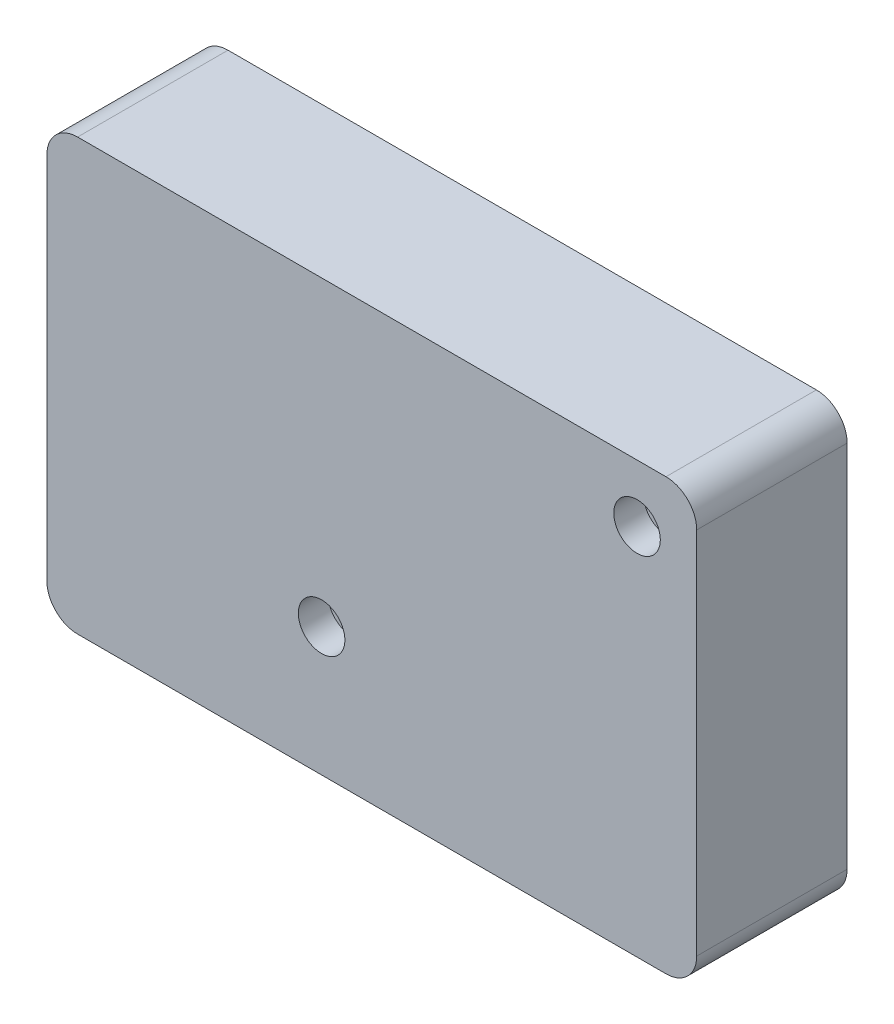
ISO-10303-21;
HEADER;
FILE_DESCRIPTION(('STEP AP214'),'2;1');
FILE_NAME('part.step','',(''),(''),'','','');
FILE_SCHEMA(('AUTOMOTIVE_DESIGN { 1 0 10303 214 1 1 1 1 }'));
ENDSEC;
DATA;
#1=APPLICATION_CONTEXT('core data for automotive mechanical design processes');
#2=APPLICATION_PROTOCOL_DEFINITION('international standard','automotive_design',2000,#1);
#3=PRODUCT_CONTEXT('',#1,'mechanical');
#4=PRODUCT('Part','Part','',(#3));
#5=PRODUCT_RELATED_PRODUCT_CATEGORY('part','',(#4));
#6=PRODUCT_DEFINITION_FORMATION('','',#4);
#7=PRODUCT_DEFINITION_CONTEXT('part definition',#1,'design');
#8=PRODUCT_DEFINITION('design','',#6,#7);
#9=PRODUCT_DEFINITION_SHAPE('','',#8);
#10=(LENGTH_UNIT() NAMED_UNIT(*) SI_UNIT(.MILLI.,.METRE.));
#11=(NAMED_UNIT(*) PLANE_ANGLE_UNIT() SI_UNIT($,.RADIAN.));
#12=(NAMED_UNIT(*) SI_UNIT($,.STERADIAN.) SOLID_ANGLE_UNIT());
#13=UNCERTAINTY_MEASURE_WITH_UNIT(LENGTH_MEASURE(1.E-05),#10,'distance_accuracy_value','');
#14=(GEOMETRIC_REPRESENTATION_CONTEXT(3) GLOBAL_UNCERTAINTY_ASSIGNED_CONTEXT((#13)) GLOBAL_UNIT_ASSIGNED_CONTEXT((#10,
#11,#12)) REPRESENTATION_CONTEXT('',''));
#15=CARTESIAN_POINT('',(0.,0.,0.));
#16=DIRECTION('',(0.,0.,1.));
#17=DIRECTION('',(1.,0.,0.));
#18=AXIS2_PLACEMENT_3D('',#15,#16,#17);
#19=CARTESIAN_POINT('',(32.1648757838848,-17.3338334444158,-15.));
#20=DIRECTION('',(0.,0.,1.));
#21=DIRECTION('',(1.,0.,0.));
#22=AXIS2_PLACEMENT_3D('',#19,#20,#21);
#23=CYLINDRICAL_SURFACE('',#22,3.575);
#24=CARTESIAN_POINT('',(32.1648757838848,-17.3338334444158,2.5));
#25=DIRECTION('',(0.,0.,1.));
#26=DIRECTION('',(1.,0.,0.));
#27=AXIS2_PLACEMENT_3D('',#24,#25,#26);
#28=CIRCLE('',#27,3.575);
#29=CARTESIAN_POINT('',(32.1648757838848,-20.9088334444158,2.5));
#30=VERTEX_POINT('',#29);
#31=CARTESIAN_POINT('',(35.7398757838848,-17.3338334444158,2.5));
#32=VERTEX_POINT('',#31);
#33=EDGE_CURVE('E275',#30,#32,#28,.T.);
#34=ORIENTED_EDGE('',*,*,#33,.F.);
#35=DIRECTION('',(0.,0.,1.));
#36=VECTOR('',#35,1.);
#37=CARTESIAN_POINT('',(32.1648757838848,-20.9088334444158,-15.));
#38=LINE('',#37,#36);
#39=CARTESIAN_POINT('',(32.1648757838848,-20.9088334444158,-15.));
#40=VERTEX_POINT('',#39);
#41=EDGE_CURVE('E292',#40,#30,#38,.T.);
#42=ORIENTED_EDGE('',*,*,#41,.F.);
#43=CARTESIAN_POINT('',(32.1648757838848,-17.3338334444158,-15.));
#44=DIRECTION('',(0.,0.,1.));
#45=DIRECTION('',(1.,0.,0.));
#46=AXIS2_PLACEMENT_3D('',#43,#44,#45);
#47=CIRCLE('',#46,3.575);
#48=CARTESIAN_POINT('',(35.7398757838848,-17.3338334444158,-15.));
#49=VERTEX_POINT('',#48);
#50=EDGE_CURVE('E303',#40,#49,#47,.T.);
#51=ORIENTED_EDGE('',*,*,#50,.T.);
#52=DIRECTION('',(0.,0.,1.));
#53=VECTOR('',#52,1.);
#54=CARTESIAN_POINT('',(35.7398757838848,-17.3338334444158,-15.));
#55=LINE('',#54,#53);
#56=EDGE_CURVE('E296',#49,#32,#55,.T.);
#57=ORIENTED_EDGE('',*,*,#56,.T.);
#58=EDGE_LOOP('',(#34,#42,#51,#57));
#59=FACE_BOUND('',#58,.T.);
#60=ADVANCED_FACE('F35',(#59),#23,.T.);
#61=CARTESIAN_POINT('',(32.1648757838848,-20.9088334444158,-15.));
#62=DIRECTION('',(0.,-1.,0.));
#63=DIRECTION('',(1.,0.,0.));
#64=AXIS2_PLACEMENT_3D('',#61,#62,#63);
#65=PLANE('',#64);
#66=DIRECTION('',(1.,0.,0.));
#67=VECTOR('',#66,1.);
#68=CARTESIAN_POINT('',(32.1648757838848,-20.9088334444158,2.5));
#69=LINE('',#68,#67);
#70=CARTESIAN_POINT('',(-36.2951242161152,-20.9088334444158,2.5));
#71=VERTEX_POINT('',#70);
#72=EDGE_CURVE('E300',#71,#30,#69,.T.);
#73=ORIENTED_EDGE('',*,*,#72,.F.);
#74=DIRECTION('',(0.,0.,1.));
#75=VECTOR('',#74,1.);
#76=CARTESIAN_POINT('',(-36.2951242161152,-20.9088334444158,-15.));
#77=LINE('',#76,#75);
#78=CARTESIAN_POINT('',(-36.2951242161152,-20.9088334444158,-15.));
#79=VERTEX_POINT('',#78);
#80=EDGE_CURVE('E295',#79,#71,#77,.T.);
#81=ORIENTED_EDGE('',*,*,#80,.F.);
#82=DIRECTION('',(1.,0.,0.));
#83=VECTOR('',#82,1.);
#84=CARTESIAN_POINT('',(32.1648757838848,-20.9088334444158,-15.));
#85=LINE('',#84,#83);
#86=EDGE_CURVE('E299',#79,#40,#85,.T.);
#87=ORIENTED_EDGE('',*,*,#86,.T.);
#88=ORIENTED_EDGE('',*,*,#41,.T.);
#89=EDGE_LOOP('',(#73,#81,#87,#88));
#90=FACE_BOUND('',#89,.T.);
#91=ADVANCED_FACE('F417',(#90),#65,.T.);
#92=CARTESIAN_POINT('',(-36.2951242161152,-17.3338334444158,-15.));
#93=DIRECTION('',(0.,0.,1.));
#94=DIRECTION('',(1.,0.,0.));
#95=AXIS2_PLACEMENT_3D('',#92,#93,#94);
#96=CYLINDRICAL_SURFACE('',#95,3.575);
#97=CARTESIAN_POINT('',(-36.2951242161152,-17.3338334444158,2.5));
#98=DIRECTION('',(0.,0.,1.));
#99=DIRECTION('',(1.,0.,0.));
#100=AXIS2_PLACEMENT_3D('',#97,#98,#99);
#101=CIRCLE('',#100,3.575);
#102=CARTESIAN_POINT('',(-39.8701242161152,-17.3338334444158,2.5));
#103=VERTEX_POINT('',#102);
#104=EDGE_CURVE('E304',#103,#71,#101,.T.);
#105=ORIENTED_EDGE('',*,*,#104,.F.);
#106=DIRECTION('',(0.,0.,1.));
#107=VECTOR('',#106,1.);
#108=CARTESIAN_POINT('',(-39.8701242161152,-17.3338334444158,-15.));
#109=LINE('',#108,#107);
#110=CARTESIAN_POINT('',(-39.8701242161152,-17.3338334444158,-15.));
#111=VERTEX_POINT('',#110);
#112=EDGE_CURVE('E306',#111,#103,#109,.T.);
#113=ORIENTED_EDGE('',*,*,#112,.F.);
#114=CARTESIAN_POINT('',(-36.2951242161152,-17.3338334444158,-15.));
#115=DIRECTION('',(0.,0.,1.));
#116=DIRECTION('',(1.,0.,0.));
#117=AXIS2_PLACEMENT_3D('',#114,#115,#116);
#118=CIRCLE('',#117,3.575);
#119=EDGE_CURVE('E336',#111,#79,#118,.T.);
#120=ORIENTED_EDGE('',*,*,#119,.T.);
#121=ORIENTED_EDGE('',*,*,#80,.T.);
#122=EDGE_LOOP('',(#105,#113,#120,#121));
#123=FACE_BOUND('',#122,.T.);
#124=ADVANCED_FACE('F394',(#123),#96,.T.);
#125=CARTESIAN_POINT('',(-39.8701242161152,-17.3338334444158,-15.));
#126=DIRECTION('',(-1.,0.,0.));
#127=DIRECTION('',(0.,-1.,0.));
#128=AXIS2_PLACEMENT_3D('',#125,#126,#127);
#129=PLANE('',#128);
#130=DIRECTION('',(0.,0.,1.));
#131=VECTOR('',#130,1.);
#132=CARTESIAN_POINT('',(-39.8701242161152,3.27641603124108,-3.7));
#133=LINE('',#132,#131);
#134=CARTESIAN_POINT('',(-39.8701242161152,3.27641603124108,-15.));
#135=VERTEX_POINT('',#134);
#136=CARTESIAN_POINT('',(-39.8701242161152,3.27641603124108,-3.7));
#137=VERTEX_POINT('',#136);
#138=EDGE_CURVE('E182',#135,#137,#133,.T.);
#139=ORIENTED_EDGE('',*,*,#138,.F.);
#140=DIRECTION('',(0.,-1.,0.));
#141=VECTOR('',#140,1.);
#142=CARTESIAN_POINT('',(-39.8701242161152,-17.3338334444158,-15.));
#143=LINE('',#142,#141);
#144=EDGE_CURVE('E341',#135,#111,#143,.T.);
#145=ORIENTED_EDGE('',*,*,#144,.T.);
#146=ORIENTED_EDGE('',*,*,#112,.T.);
#147=DIRECTION('',(0.,-1.,0.));
#148=VECTOR('',#147,1.);
#149=CARTESIAN_POINT('',(-39.8701242161152,-17.3338334444158,2.5));
#150=LINE('',#149,#148);
#151=CARTESIAN_POINT('',(-39.8701242161152,25.6061665555842,2.5));
#152=VERTEX_POINT('',#151);
#153=EDGE_CURVE('E309',#152,#103,#150,.T.);
#154=ORIENTED_EDGE('',*,*,#153,.F.);
#155=DIRECTION('',(0.,0.,1.));
#156=VECTOR('',#155,1.);
#157=CARTESIAN_POINT('',(-39.8701242161152,25.6061665555842,-15.));
#158=LINE('',#157,#156);
#159=CARTESIAN_POINT('',(-39.8701242161152,25.6061665555842,-15.));
#160=VERTEX_POINT('',#159);
#161=EDGE_CURVE('E311',#160,#152,#158,.T.);
#162=ORIENTED_EDGE('',*,*,#161,.F.);
#163=CARTESIAN_POINT('',(-39.8701242161152,14.3846742519358,-15.));
#164=VERTEX_POINT('',#163);
#165=EDGE_CURVE('E339',#160,#164,#143,.T.);
#166=ORIENTED_EDGE('',*,*,#165,.T.);
#167=DIRECTION('',(0.,0.,-1.));
#168=VECTOR('',#167,1.);
#169=CARTESIAN_POINT('',(-39.8701242161152,14.3846742519358,-15.));
#170=LINE('',#169,#168);
#171=CARTESIAN_POINT('',(-39.8701242161152,14.3846742519358,-3.7));
#172=VERTEX_POINT('',#171);
#173=EDGE_CURVE('E179',#172,#164,#170,.T.);
#174=ORIENTED_EDGE('',*,*,#173,.F.);
#175=DIRECTION('',(0.,1.,0.));
#176=VECTOR('',#175,1.);
#177=CARTESIAN_POINT('',(-39.8701242161152,3.27641603124108,-3.7));
#178=LINE('',#177,#176);
#179=EDGE_CURVE('E174',#137,#172,#178,.T.);
#180=ORIENTED_EDGE('',*,*,#179,.F.);
#181=EDGE_LOOP('',(#139,#145,#146,#154,#162,#166,#174,#180));
#182=FACE_BOUND('',#181,.T.);
#183=ADVANCED_FACE('F189',(#182),#129,.T.);
#184=CARTESIAN_POINT('',(-36.2951242161152,25.6061665555842,-15.));
#185=DIRECTION('',(0.,0.,1.));
#186=DIRECTION('',(1.,0.,0.));
#187=AXIS2_PLACEMENT_3D('',#184,#185,#186);
#188=CYLINDRICAL_SURFACE('',#187,3.575);
#189=CARTESIAN_POINT('',(-36.2951242161152,25.6061665555842,2.5));
#190=DIRECTION('',(0.,0.,1.));
#191=DIRECTION('',(1.,0.,0.));
#192=AXIS2_PLACEMENT_3D('',#189,#190,#191);
#193=CIRCLE('',#192,3.575);
#194=CARTESIAN_POINT('',(-36.2951242161151,29.1811665555842,2.5));
#195=VERTEX_POINT('',#194);
#196=EDGE_CURVE('E314',#195,#152,#193,.T.);
#197=ORIENTED_EDGE('',*,*,#196,.F.);
#198=DIRECTION('',(0.,0.,1.));
#199=VECTOR('',#198,1.);
#200=CARTESIAN_POINT('',(-36.2951242161151,29.1811665555842,-15.));
#201=LINE('',#200,#199);
#202=CARTESIAN_POINT('',(-36.2951242161152,29.1811665555842,-15.));
#203=VERTEX_POINT('',#202);
#204=EDGE_CURVE('E316',#203,#195,#201,.T.);
#205=ORIENTED_EDGE('',*,*,#204,.F.);
#206=CARTESIAN_POINT('',(-36.2951242161152,25.6061665555842,-15.));
#207=DIRECTION('',(0.,0.,1.));
#208=DIRECTION('',(1.,0.,0.));
#209=AXIS2_PLACEMENT_3D('',#206,#207,#208);
#210=CIRCLE('',#209,3.575);
#211=EDGE_CURVE('E342',#203,#160,#210,.T.);
#212=ORIENTED_EDGE('',*,*,#211,.T.);
#213=ORIENTED_EDGE('',*,*,#161,.T.);
#214=EDGE_LOOP('',(#197,#205,#212,#213));
#215=FACE_BOUND('',#214,.T.);
#216=ADVANCED_FACE('F401',(#215),#188,.T.);
#217=CARTESIAN_POINT('',(32.1648757838848,29.1811665555842,-15.));
#218=DIRECTION('',(0.,1.,0.));
#219=DIRECTION('',(-1.,0.,0.));
#220=AXIS2_PLACEMENT_3D('',#217,#218,#219);
#221=PLANE('',#220);
#222=DIRECTION('',(-1.,0.,0.));
#223=VECTOR('',#222,1.);
#224=CARTESIAN_POINT('',(32.1648757838848,29.1811665555842,2.5));
#225=LINE('',#224,#223);
#226=CARTESIAN_POINT('',(32.1648757838848,29.1811665555842,2.5));
#227=VERTEX_POINT('',#226);
#228=EDGE_CURVE('E319',#227,#195,#225,.T.);
#229=ORIENTED_EDGE('',*,*,#228,.F.);
#230=DIRECTION('',(0.,0.,1.));
#231=VECTOR('',#230,1.);
#232=CARTESIAN_POINT('',(32.1648757838848,29.1811665555842,-15.));
#233=LINE('',#232,#231);
#234=CARTESIAN_POINT('',(32.1648757838848,29.1811665555842,-15.));
#235=VERTEX_POINT('',#234);
#236=EDGE_CURVE('E321',#235,#227,#233,.T.);
#237=ORIENTED_EDGE('',*,*,#236,.F.);
#238=DIRECTION('',(-1.,0.,0.));
#239=VECTOR('',#238,1.);
#240=CARTESIAN_POINT('',(32.1648757838848,29.1811665555842,-15.));
#241=LINE('',#240,#239);
#242=EDGE_CURVE('E345',#235,#203,#241,.T.);
#243=ORIENTED_EDGE('',*,*,#242,.T.);
#244=ORIENTED_EDGE('',*,*,#204,.T.);
#245=EDGE_LOOP('',(#229,#237,#243,#244));
#246=FACE_BOUND('',#245,.T.);
#247=ADVANCED_FACE('F404',(#246),#221,.T.);
#248=CARTESIAN_POINT('',(32.1648757838848,25.6061665555842,-15.));
#249=DIRECTION('',(0.,0.,1.));
#250=DIRECTION('',(1.,0.,0.));
#251=AXIS2_PLACEMENT_3D('',#248,#249,#250);
#252=CYLINDRICAL_SURFACE('',#251,3.575);
#253=CARTESIAN_POINT('',(32.1648757838848,25.6061665555842,2.5));
#254=DIRECTION('',(0.,0.,1.));
#255=DIRECTION('',(1.,0.,0.));
#256=AXIS2_PLACEMENT_3D('',#253,#254,#255);
#257=CIRCLE('',#256,3.575);
#258=CARTESIAN_POINT('',(35.7398757838848,25.6061665555842,2.5));
#259=VERTEX_POINT('',#258);
#260=EDGE_CURVE('E324',#259,#227,#257,.T.);
#261=ORIENTED_EDGE('',*,*,#260,.F.);
#262=DIRECTION('',(0.,0.,-1.));
#263=VECTOR('',#262,1.);
#264=CARTESIAN_POINT('',(35.7398757838848,25.6061665555842,-15.));
#265=LINE('',#264,#263);
#266=CARTESIAN_POINT('',(35.7398757838848,25.6061665555842,-15.));
#267=VERTEX_POINT('',#266);
#268=EDGE_CURVE('E298',#267,#259,#265,.F.);
#269=ORIENTED_EDGE('',*,*,#268,.F.);
#270=CARTESIAN_POINT('',(32.1648757838848,25.6061665555842,-15.));
#271=DIRECTION('',(0.,0.,1.));
#272=DIRECTION('',(1.,0.,0.));
#273=AXIS2_PLACEMENT_3D('',#270,#271,#272);
#274=CIRCLE('',#273,3.575);
#275=EDGE_CURVE('E348',#267,#235,#274,.T.);
#276=ORIENTED_EDGE('',*,*,#275,.T.);
#277=ORIENTED_EDGE('',*,*,#236,.T.);
#278=EDGE_LOOP('',(#261,#269,#276,#277));
#279=FACE_BOUND('',#278,.T.);
#280=ADVANCED_FACE('F409',(#279),#252,.T.);
#281=CARTESIAN_POINT('',(35.7398757838848,-17.3338334444158,-15.));
#282=DIRECTION('',(1.,0.,0.));
#283=DIRECTION('',(0.,0.,-1.));
#284=AXIS2_PLACEMENT_3D('',#281,#282,#283);
#285=PLANE('',#284);
#286=DIRECTION('',(0.,1.,0.));
#287=VECTOR('',#286,1.);
#288=CARTESIAN_POINT('',(35.7398757838848,-17.3338334444158,2.5));
#289=LINE('',#288,#287);
#290=EDGE_CURVE('E291',#32,#259,#289,.T.);
#291=ORIENTED_EDGE('',*,*,#290,.F.);
#292=ORIENTED_EDGE('',*,*,#56,.F.);
#293=DIRECTION('',(0.,1.,0.));
#294=VECTOR('',#293,1.);
#295=CARTESIAN_POINT('',(35.7398757838848,-17.3338334444158,-15.));
#296=LINE('',#295,#294);
#297=EDGE_CURVE('E333',#49,#267,#296,.T.);
#298=ORIENTED_EDGE('',*,*,#297,.T.);
#299=ORIENTED_EDGE('',*,*,#268,.T.);
#300=EDGE_LOOP('',(#291,#292,#298,#299));
#301=FACE_BOUND('',#300,.T.);
#302=ADVANCED_FACE('F412',(#301),#285,.T.);
#303=CARTESIAN_POINT('',(32.1648757838848,-17.3338334444158,-15.));
#304=DIRECTION('',(0.,0.,1.));
#305=DIRECTION('',(1.,0.,0.));
#306=AXIS2_PLACEMENT_3D('',#303,#304,#305);
#307=PLANE('',#306);
#308=ORIENTED_EDGE('',*,*,#144,.F.);
#309=DIRECTION('',(-1.,0.,0.));
#310=VECTOR('',#309,1.);
#311=CARTESIAN_POINT('',(-36.8701242161152,3.27641603124108,-15.));
#312=LINE('',#311,#310);
#313=CARTESIAN_POINT('',(-37.3701242161152,3.27641603124108,-15.));
#314=VERTEX_POINT('',#313);
#315=EDGE_CURVE('E185',#314,#135,#312,.T.);
#316=ORIENTED_EDGE('',*,*,#315,.F.);
#317=DIRECTION('',(0.,-1.,0.));
#318=VECTOR('',#317,1.);
#319=CARTESIAN_POINT('',(-37.3701242161152,-17.3338334444158,-15.));
#320=LINE('',#319,#318);
#321=CARTESIAN_POINT('',(-37.3701242161152,-17.3338334444158,-15.));
#322=VERTEX_POINT('',#321);
#323=EDGE_CURVE('E240',#314,#322,#320,.T.);
#324=ORIENTED_EDGE('',*,*,#323,.T.);
#325=CARTESIAN_POINT('',(-36.2951242161152,-17.3338334444158,-15.));
#326=DIRECTION('',(0.,0.,1.));
#327=DIRECTION('',(-1.,0.,0.));
#328=AXIS2_PLACEMENT_3D('',#325,#326,#327);
#329=CIRCLE('',#328,1.075);
#330=CARTESIAN_POINT('',(-36.2951242161152,-18.4088334444158,-15.));
#331=VERTEX_POINT('',#330);
#332=EDGE_CURVE('E244',#322,#331,#329,.T.);
#333=ORIENTED_EDGE('',*,*,#332,.T.);
#334=DIRECTION('',(1.,0.,0.));
#335=VECTOR('',#334,1.);
#336=CARTESIAN_POINT('',(32.1648757838848,-18.4088334444158,-15.));
#337=LINE('',#336,#335);
#338=CARTESIAN_POINT('',(32.1648757838848,-18.4088334444158,-15.));
#339=VERTEX_POINT('',#338);
#340=EDGE_CURVE('E247',#331,#339,#337,.T.);
#341=ORIENTED_EDGE('',*,*,#340,.T.);
#342=CARTESIAN_POINT('',(32.1648757838848,-17.3338334444158,-15.));
#343=DIRECTION('',(0.,0.,1.));
#344=DIRECTION('',(1.,0.,0.));
#345=AXIS2_PLACEMENT_3D('',#342,#343,#344);
#346=CIRCLE('',#345,1.075);
#347=CARTESIAN_POINT('',(33.2398757838848,-17.3338334444158,-15.));
#348=VERTEX_POINT('',#347);
#349=EDGE_CURVE('E226',#339,#348,#346,.T.);
#350=ORIENTED_EDGE('',*,*,#349,.T.);
#351=DIRECTION('',(0.,1.,0.));
#352=VECTOR('',#351,1.);
#353=CARTESIAN_POINT('',(33.2398757838848,-17.3338334444158,-15.));
#354=LINE('',#353,#352);
#355=CARTESIAN_POINT('',(33.2398757838848,25.6061665555842,-15.));
#356=VERTEX_POINT('',#355);
#357=EDGE_CURVE('E229',#348,#356,#354,.T.);
#358=ORIENTED_EDGE('',*,*,#357,.T.);
#359=CARTESIAN_POINT('',(32.1648757838848,25.6061665555842,-15.));
#360=DIRECTION('',(0.,0.,1.));
#361=DIRECTION('',(1.,0.,0.));
#362=AXIS2_PLACEMENT_3D('',#359,#360,#361);
#363=CIRCLE('',#362,1.075);
#364=CARTESIAN_POINT('',(32.1648757838848,26.6811665555842,-15.));
#365=VERTEX_POINT('',#364);
#366=EDGE_CURVE('E58',#356,#365,#363,.T.);
#367=ORIENTED_EDGE('',*,*,#366,.T.);
#368=DIRECTION('',(-1.,0.,0.));
#369=VECTOR('',#368,1.);
#370=CARTESIAN_POINT('',(32.1648757838848,26.6811665555842,-15.));
#371=LINE('',#370,#369);
#372=CARTESIAN_POINT('',(-36.2951242161152,26.6811665555842,-15.));
#373=VERTEX_POINT('',#372);
#374=EDGE_CURVE('E234',#365,#373,#371,.T.);
#375=ORIENTED_EDGE('',*,*,#374,.T.);
#376=CARTESIAN_POINT('',(-36.2951242161152,25.6061665555842,-15.));
#377=DIRECTION('',(0.,0.,1.));
#378=DIRECTION('',(-1.,0.,0.));
#379=AXIS2_PLACEMENT_3D('',#376,#377,#378);
#380=CIRCLE('',#379,1.075);
#381=CARTESIAN_POINT('',(-37.3701242161152,25.6061665555842,-15.));
#382=VERTEX_POINT('',#381);
#383=EDGE_CURVE('E237',#373,#382,#380,.T.);
#384=ORIENTED_EDGE('',*,*,#383,.T.);
#385=CARTESIAN_POINT('',(-37.3701242161152,14.3846742519358,-15.));
#386=VERTEX_POINT('',#385);
#387=EDGE_CURVE('E241',#382,#386,#320,.T.);
#388=ORIENTED_EDGE('',*,*,#387,.T.);
#389=DIRECTION('',(-1.,0.,0.));
#390=VECTOR('',#389,1.);
#391=CARTESIAN_POINT('',(-36.8701242161152,14.3846742519358,-15.));
#392=LINE('',#391,#390);
#393=EDGE_CURVE('E196',#386,#164,#392,.T.);
#394=ORIENTED_EDGE('',*,*,#393,.T.);
#395=ORIENTED_EDGE('',*,*,#165,.F.);
#396=ORIENTED_EDGE('',*,*,#211,.F.);
#397=ORIENTED_EDGE('',*,*,#242,.F.);
#398=ORIENTED_EDGE('',*,*,#275,.F.);
#399=ORIENTED_EDGE('',*,*,#297,.F.);
#400=ORIENTED_EDGE('',*,*,#50,.F.);
#401=ORIENTED_EDGE('',*,*,#86,.F.);
#402=ORIENTED_EDGE('',*,*,#119,.F.);
#403=EDGE_LOOP('',(#308,#316,#324,#333,#341,#350,#358,#367,#375,#384,#388,#394,#395,#396,#397,
#398,#399,#400,#401,#402));
#404=FACE_BOUND('',#403,.T.);
#405=ADVANCED_FACE('F369',(#404),#307,.F.);
#406=CARTESIAN_POINT('',(32.1648757838848,-17.3338334444158,2.5));
#407=DIRECTION('',(0.,0.,1.));
#408=DIRECTION('',(1.,0.,0.));
#409=AXIS2_PLACEMENT_3D('',#406,#407,#408);
#410=PLANE('',#409);
#411=CARTESIAN_POINT('',(-7.90612421611517,-5.96276144441579,2.5));
#412=DIRECTION('',(0.,0.,1.));
#413=DIRECTION('',(1.,0.,0.));
#414=AXIS2_PLACEMENT_3D('',#411,#412,#413);
#415=CIRCLE('',#414,2.70834889970277);
#416=CARTESIAN_POINT('',(-5.19777531641241,-5.96276144441579,2.5));
#417=VERTEX_POINT('',#416);
#418=EDGE_CURVE('E208',#417,#417,#415,.F.);
#419=ORIENTED_EDGE('',*,*,#418,.T.);
#420=EDGE_LOOP('',(#419));
#421=FACE_BOUND('',#420,.T.);
#422=CARTESIAN_POINT('',(28.7968757838848,22.4852385555842,2.5));
#423=DIRECTION('',(0.,0.,1.));
#424=DIRECTION('',(1.,0.,0.));
#425=AXIS2_PLACEMENT_3D('',#422,#423,#424);
#426=CIRCLE('',#425,2.70834889970276);
#427=CARTESIAN_POINT('',(31.5052246835876,22.4852385555842,2.5));
#428=VERTEX_POINT('',#427);
#429=EDGE_CURVE('E207',#428,#428,#426,.F.);
#430=ORIENTED_EDGE('',*,*,#429,.T.);
#431=EDGE_LOOP('',(#430));
#432=FACE_BOUND('',#431,.T.);
#433=ORIENTED_EDGE('',*,*,#33,.T.);
#434=ORIENTED_EDGE('',*,*,#290,.T.);
#435=ORIENTED_EDGE('',*,*,#260,.T.);
#436=ORIENTED_EDGE('',*,*,#228,.T.);
#437=ORIENTED_EDGE('',*,*,#196,.T.);
#438=ORIENTED_EDGE('',*,*,#153,.T.);
#439=ORIENTED_EDGE('',*,*,#104,.T.);
#440=ORIENTED_EDGE('',*,*,#72,.T.);
#441=EDGE_LOOP('',(#433,#434,#435,#436,#437,#438,#439,#440));
#442=FACE_BOUND('',#441,.T.);
#443=ADVANCED_FACE('F37',(#421,#432,#442),#410,.T.);
#444=CARTESIAN_POINT('',(32.1648757838848,-17.3338334444158,-15.));
#445=DIRECTION('',(0.,0.,1.));
#446=DIRECTION('',(1.,0.,0.));
#447=AXIS2_PLACEMENT_3D('',#444,#445,#446);
#448=CYLINDRICAL_SURFACE('',#447,1.075);
#449=CARTESIAN_POINT('',(32.1648757838848,-17.3338334444158,0.));
#450=DIRECTION('',(0.,0.,1.));
#451=DIRECTION('',(1.,0.,0.));
#452=AXIS2_PLACEMENT_3D('',#449,#450,#451);
#453=CIRCLE('',#452,1.075);
#454=CARTESIAN_POINT('',(32.1648757838848,-18.4088334444158,0.));
#455=VERTEX_POINT('',#454);
#456=CARTESIAN_POINT('',(33.2398757838848,-17.3338334444158,0.));
#457=VERTEX_POINT('',#456);
#458=EDGE_CURVE('E225',#455,#457,#453,.T.);
#459=ORIENTED_EDGE('',*,*,#458,.T.);
#460=DIRECTION('',(0.,0.,1.));
#461=VECTOR('',#460,1.);
#462=CARTESIAN_POINT('',(33.2398757838848,-17.3338334444158,-15.));
#463=LINE('',#462,#461);
#464=EDGE_CURVE('E250',#348,#457,#463,.T.);
#465=ORIENTED_EDGE('',*,*,#464,.F.);
#466=ORIENTED_EDGE('',*,*,#349,.F.);
#467=DIRECTION('',(0.,0.,1.));
#468=VECTOR('',#467,1.);
#469=CARTESIAN_POINT('',(32.1648757838848,-18.4088334444158,-15.));
#470=LINE('',#469,#468);
#471=EDGE_CURVE('E273',#339,#455,#470,.T.);
#472=ORIENTED_EDGE('',*,*,#471,.T.);
#473=EDGE_LOOP('',(#459,#465,#466,#472));
#474=FACE_BOUND('',#473,.T.);
#475=ADVANCED_FACE('F442',(#474),#448,.F.);
#476=CARTESIAN_POINT('',(32.1648757838848,-18.4088334444158,-15.));
#477=DIRECTION('',(0.,-1.,0.));
#478=DIRECTION('',(1.,0.,0.));
#479=AXIS2_PLACEMENT_3D('',#476,#477,#478);
#480=PLANE('',#479);
#481=DIRECTION('',(1.,0.,0.));
#482=VECTOR('',#481,1.);
#483=CARTESIAN_POINT('',(32.1648757838848,-18.4088334444158,0.));
#484=LINE('',#483,#482);
#485=CARTESIAN_POINT('',(-36.2951242161152,-18.4088334444158,0.));
#486=VERTEX_POINT('',#485);
#487=EDGE_CURVE('E230',#486,#455,#484,.T.);
#488=ORIENTED_EDGE('',*,*,#487,.T.);
#489=ORIENTED_EDGE('',*,*,#471,.F.);
#490=ORIENTED_EDGE('',*,*,#340,.F.);
#491=DIRECTION('',(0.,0.,1.));
#492=VECTOR('',#491,1.);
#493=CARTESIAN_POINT('',(-36.2951242161152,-18.4088334444158,-15.));
#494=LINE('',#493,#492);
#495=EDGE_CURVE('E276',#331,#486,#494,.T.);
#496=ORIENTED_EDGE('',*,*,#495,.T.);
#497=EDGE_LOOP('',(#488,#489,#490,#496));
#498=FACE_BOUND('',#497,.T.);
#499=ADVANCED_FACE('F447',(#498),#480,.F.);
#500=CARTESIAN_POINT('',(-36.2951242161152,-17.3338334444158,-15.));
#501=DIRECTION('',(0.,0.,1.));
#502=DIRECTION('',(1.,0.,0.));
#503=AXIS2_PLACEMENT_3D('',#500,#501,#502);
#504=CYLINDRICAL_SURFACE('',#503,1.075);
#505=CARTESIAN_POINT('',(-36.2951242161152,-17.3338334444158,0.));
#506=DIRECTION('',(0.,0.,1.));
#507=DIRECTION('',(-1.,0.,0.));
#508=AXIS2_PLACEMENT_3D('',#505,#506,#507);
#509=CIRCLE('',#508,1.075);
#510=CARTESIAN_POINT('',(-37.3701242161152,-17.3338334444158,0.));
#511=VERTEX_POINT('',#510);
#512=EDGE_CURVE('E268',#511,#486,#509,.T.);
#513=ORIENTED_EDGE('',*,*,#512,.T.);
#514=ORIENTED_EDGE('',*,*,#495,.F.);
#515=ORIENTED_EDGE('',*,*,#332,.F.);
#516=DIRECTION('',(0.,0.,1.));
#517=VECTOR('',#516,1.);
#518=CARTESIAN_POINT('',(-37.3701242161152,-17.3338334444158,-15.));
#519=LINE('',#518,#517);
#520=EDGE_CURVE('E278',#322,#511,#519,.T.);
#521=ORIENTED_EDGE('',*,*,#520,.T.);
#522=EDGE_LOOP('',(#513,#514,#515,#521));
#523=FACE_BOUND('',#522,.T.);
#524=ADVANCED_FACE('F385',(#523),#504,.F.);
#525=CARTESIAN_POINT('',(-37.3701242161152,-17.3338334444158,-15.));
#526=DIRECTION('',(-1.,0.,0.));
#527=DIRECTION('',(0.,-1.,0.));
#528=AXIS2_PLACEMENT_3D('',#525,#526,#527);
#529=PLANE('',#528);
#530=ORIENTED_EDGE('',*,*,#323,.F.);
#531=DIRECTION('',(0.,0.,1.));
#532=VECTOR('',#531,1.);
#533=CARTESIAN_POINT('',(-37.3701242161152,3.27641603124108,-15.));
#534=LINE('',#533,#532);
#535=CARTESIAN_POINT('',(-37.3701242161152,3.27641603124107,-3.7));
#536=VERTEX_POINT('',#535);
#537=EDGE_CURVE('E11',#314,#536,#534,.T.);
#538=ORIENTED_EDGE('',*,*,#537,.T.);
#539=DIRECTION('',(0.,1.,0.));
#540=VECTOR('',#539,1.);
#541=CARTESIAN_POINT('',(-37.3701242161152,-17.3338334444158,-3.7));
#542=LINE('',#541,#540);
#543=CARTESIAN_POINT('',(-37.3701242161152,14.3846742519358,-3.7));
#544=VERTEX_POINT('',#543);
#545=EDGE_CURVE('E177',#536,#544,#542,.T.);
#546=ORIENTED_EDGE('',*,*,#545,.T.);
#547=DIRECTION('',(0.,0.,-1.));
#548=VECTOR('',#547,1.);
#549=CARTESIAN_POINT('',(-37.3701242161152,14.3846742519358,-15.));
#550=LINE('',#549,#548);
#551=EDGE_CURVE('E43',#544,#386,#550,.T.);
#552=ORIENTED_EDGE('',*,*,#551,.T.);
#553=ORIENTED_EDGE('',*,*,#387,.F.);
#554=DIRECTION('',(0.,0.,1.));
#555=VECTOR('',#554,1.);
#556=CARTESIAN_POINT('',(-37.3701242161152,25.6061665555842,-15.));
#557=LINE('',#556,#555);
#558=CARTESIAN_POINT('',(-37.3701242161152,25.6061665555842,0.));
#559=VERTEX_POINT('',#558);
#560=EDGE_CURVE('E280',#382,#559,#557,.T.);
#561=ORIENTED_EDGE('',*,*,#560,.T.);
#562=DIRECTION('',(0.,-1.,0.));
#563=VECTOR('',#562,1.);
#564=CARTESIAN_POINT('',(-37.3701242161152,-17.3338334444158,0.));
#565=LINE('',#564,#563);
#566=EDGE_CURVE('E265',#559,#511,#565,.T.);
#567=ORIENTED_EDGE('',*,*,#566,.T.);
#568=ORIENTED_EDGE('',*,*,#520,.F.);
#569=EDGE_LOOP('',(#530,#538,#546,#552,#553,#561,#567,#568));
#570=FACE_BOUND('',#569,.T.);
#571=ADVANCED_FACE('F366',(#570),#529,.F.);
#572=CARTESIAN_POINT('',(-36.2951242161152,25.6061665555842,-15.));
#573=DIRECTION('',(0.,0.,1.));
#574=DIRECTION('',(1.,0.,0.));
#575=AXIS2_PLACEMENT_3D('',#572,#573,#574);
#576=CYLINDRICAL_SURFACE('',#575,1.075);
#577=CARTESIAN_POINT('',(-36.2951242161152,25.6061665555842,0.));
#578=DIRECTION('',(0.,0.,1.));
#579=DIRECTION('',(-1.,0.,0.));
#580=AXIS2_PLACEMENT_3D('',#577,#578,#579);
#581=CIRCLE('',#580,1.075);
#582=CARTESIAN_POINT('',(-36.2951242161152,26.6811665555842,0.));
#583=VERTEX_POINT('',#582);
#584=EDGE_CURVE('E262',#583,#559,#581,.T.);
#585=ORIENTED_EDGE('',*,*,#584,.T.);
#586=ORIENTED_EDGE('',*,*,#560,.F.);
#587=ORIENTED_EDGE('',*,*,#383,.F.);
#588=DIRECTION('',(0.,0.,1.));
#589=VECTOR('',#588,1.);
#590=CARTESIAN_POINT('',(-36.2951242161152,26.6811665555842,-15.));
#591=LINE('',#590,#589);
#592=EDGE_CURVE('E282',#373,#583,#591,.T.);
#593=ORIENTED_EDGE('',*,*,#592,.T.);
#594=EDGE_LOOP('',(#585,#586,#587,#593));
#595=FACE_BOUND('',#594,.T.);
#596=ADVANCED_FACE('F374',(#595),#576,.F.);
#597=CARTESIAN_POINT('',(32.1648757838848,26.6811665555842,-15.));
#598=DIRECTION('',(0.,1.,0.));
#599=DIRECTION('',(-1.,0.,0.));
#600=AXIS2_PLACEMENT_3D('',#597,#598,#599);
#601=PLANE('',#600);
#602=DIRECTION('',(-1.,0.,0.));
#603=VECTOR('',#602,1.);
#604=CARTESIAN_POINT('',(32.1648757838848,26.6811665555842,0.));
#605=LINE('',#604,#603);
#606=CARTESIAN_POINT('',(32.1648757838848,26.6811665555842,0.));
#607=VERTEX_POINT('',#606);
#608=EDGE_CURVE('E259',#607,#583,#605,.T.);
#609=ORIENTED_EDGE('',*,*,#608,.T.);
#610=ORIENTED_EDGE('',*,*,#592,.F.);
#611=ORIENTED_EDGE('',*,*,#374,.F.);
#612=DIRECTION('',(0.,0.,1.));
#613=VECTOR('',#612,1.);
#614=CARTESIAN_POINT('',(32.1648757838848,26.6811665555842,-15.));
#615=LINE('',#614,#613);
#616=EDGE_CURVE('E284',#365,#607,#615,.T.);
#617=ORIENTED_EDGE('',*,*,#616,.T.);
#618=EDGE_LOOP('',(#609,#610,#611,#617));
#619=FACE_BOUND('',#618,.T.);
#620=ADVANCED_FACE('F456',(#619),#601,.F.);
#621=CARTESIAN_POINT('',(32.1648757838848,25.6061665555842,-15.));
#622=DIRECTION('',(0.,0.,1.));
#623=DIRECTION('',(1.,0.,0.));
#624=AXIS2_PLACEMENT_3D('',#621,#622,#623);
#625=CYLINDRICAL_SURFACE('',#624,1.075);
#626=CARTESIAN_POINT('',(32.1648757838848,25.6061665555842,0.));
#627=DIRECTION('',(0.,0.,1.));
#628=DIRECTION('',(1.,0.,0.));
#629=AXIS2_PLACEMENT_3D('',#626,#627,#628);
#630=CIRCLE('',#629,1.075);
#631=CARTESIAN_POINT('',(33.2398757838848,25.6061665555842,0.));
#632=VERTEX_POINT('',#631);
#633=EDGE_CURVE('E256',#632,#607,#630,.T.);
#634=ORIENTED_EDGE('',*,*,#633,.T.);
#635=ORIENTED_EDGE('',*,*,#616,.F.);
#636=ORIENTED_EDGE('',*,*,#366,.F.);
#637=DIRECTION('',(0.,0.,1.));
#638=VECTOR('',#637,1.);
#639=CARTESIAN_POINT('',(33.2398757838848,25.6061665555842,-15.));
#640=LINE('',#639,#638);
#641=EDGE_CURVE('E286',#356,#632,#640,.T.);
#642=ORIENTED_EDGE('',*,*,#641,.T.);
#643=EDGE_LOOP('',(#634,#635,#636,#642));
#644=FACE_BOUND('',#643,.T.);
#645=ADVANCED_FACE('F452',(#644),#625,.F.);
#646=CARTESIAN_POINT('',(33.2398757838848,-17.3338334444158,-15.));
#647=DIRECTION('',(1.,0.,0.));
#648=DIRECTION('',(0.,0.,-1.));
#649=AXIS2_PLACEMENT_3D('',#646,#647,#648);
#650=PLANE('',#649);
#651=DIRECTION('',(0.,1.,0.));
#652=VECTOR('',#651,1.);
#653=CARTESIAN_POINT('',(33.2398757838848,-17.3338334444158,0.));
#654=LINE('',#653,#652);
#655=EDGE_CURVE('E253',#457,#632,#654,.T.);
#656=ORIENTED_EDGE('',*,*,#655,.T.);
#657=ORIENTED_EDGE('',*,*,#641,.F.);
#658=ORIENTED_EDGE('',*,*,#357,.F.);
#659=ORIENTED_EDGE('',*,*,#464,.T.);
#660=EDGE_LOOP('',(#656,#657,#658,#659));
#661=FACE_BOUND('',#660,.T.);
#662=ADVANCED_FACE('F449',(#661),#650,.F.);
#663=CARTESIAN_POINT('',(32.1648757838848,-17.3338334444158,0.));
#664=DIRECTION('',(0.,0.,1.));
#665=DIRECTION('',(1.,0.,0.));
#666=AXIS2_PLACEMENT_3D('',#663,#664,#665);
#667=PLANE('',#666);
#668=CARTESIAN_POINT('',(-7.90612421611517,-5.96276144441579,0.));
#669=DIRECTION('',(0.,0.,1.));
#670=DIRECTION('',(1.,0.,0.));
#671=AXIS2_PLACEMENT_3D('',#668,#669,#670);
#672=CIRCLE('',#671,4.191);
#673=CARTESIAN_POINT('',(-3.71512421611517,-5.96276144441579,0.));
#674=VERTEX_POINT('',#673);
#675=EDGE_CURVE('E355',#674,#674,#672,.F.);
#676=ORIENTED_EDGE('',*,*,#675,.F.);
#677=EDGE_LOOP('',(#676));
#678=FACE_BOUND('',#677,.T.);
#679=CARTESIAN_POINT('',(28.7968757838848,22.4852385555842,0.));
#680=DIRECTION('',(0.,0.,1.));
#681=DIRECTION('',(1.,0.,0.));
#682=AXIS2_PLACEMENT_3D('',#679,#680,#681);
#683=CIRCLE('',#682,4.191);
#684=CARTESIAN_POINT('',(32.9878757838848,22.4852385555842,0.));
#685=VERTEX_POINT('',#684);
#686=EDGE_CURVE('E294',#685,#685,#683,.F.);
#687=ORIENTED_EDGE('',*,*,#686,.F.);
#688=EDGE_LOOP('',(#687));
#689=FACE_BOUND('',#688,.T.);
#690=ORIENTED_EDGE('',*,*,#458,.F.);
#691=ORIENTED_EDGE('',*,*,#487,.F.);
#692=ORIENTED_EDGE('',*,*,#512,.F.);
#693=ORIENTED_EDGE('',*,*,#566,.F.);
#694=ORIENTED_EDGE('',*,*,#584,.F.);
#695=ORIENTED_EDGE('',*,*,#608,.F.);
#696=ORIENTED_EDGE('',*,*,#633,.F.);
#697=ORIENTED_EDGE('',*,*,#655,.F.);
#698=EDGE_LOOP('',(#690,#691,#692,#693,#694,#695,#696,#697));
#699=FACE_BOUND('',#698,.T.);
#700=ADVANCED_FACE('F381',(#678,#689,#699),#667,.F.);
#701=CARTESIAN_POINT('',(28.7968757838848,22.4852385555842,-2.5));
#702=DIRECTION('',(0.,0.,1.));
#703=DIRECTION('',(1.,0.,0.));
#704=AXIS2_PLACEMENT_3D('',#701,#702,#703);
#705=CYLINDRICAL_SURFACE('',#704,4.191);
#706=CARTESIAN_POINT('',(28.7968757838848,22.4852385555842,-2.5));
#707=DIRECTION('',(0.,0.,-1.));
#708=DIRECTION('',(-1.,0.,0.));
#709=AXIS2_PLACEMENT_3D('',#706,#707,#708);
#710=CIRCLE('',#709,4.191);
#711=CARTESIAN_POINT('',(24.6058757838848,22.4852385555842,-2.5));
#712=VERTEX_POINT('',#711);
#713=EDGE_CURVE('E222',#712,#712,#710,.T.);
#714=ORIENTED_EDGE('',*,*,#713,.F.);
#715=EDGE_LOOP('',(#714));
#716=FACE_BOUND('',#715,.T.);
#717=ORIENTED_EDGE('',*,*,#686,.T.);
#718=EDGE_LOOP('',(#717));
#719=FACE_BOUND('',#718,.T.);
#720=ADVANCED_FACE('F471',(#716,#719),#705,.T.);
#721=CARTESIAN_POINT('',(28.7968757838848,22.4852385555842,-2.5));
#722=DIRECTION('',(0.,0.,-1.));
#723=DIRECTION('',(-1.,0.,0.));
#724=AXIS2_PLACEMENT_3D('',#721,#722,#723);
#725=PLANE('',#724);
#726=CARTESIAN_POINT('',(28.7968757838848,22.4852385555842,-2.5));
#727=DIRECTION('',(0.,0.,-1.));
#728=DIRECTION('',(-1.,0.,0.));
#729=AXIS2_PLACEMENT_3D('',#726,#727,#728);
#730=CIRCLE('',#729,1.65);
#731=CARTESIAN_POINT('',(27.1468757838848,22.4852385555842,-2.5));
#732=VERTEX_POINT('',#731);
#733=EDGE_CURVE('E204',#732,#732,#730,.T.);
#734=ORIENTED_EDGE('',*,*,#733,.F.);
#735=EDGE_LOOP('',(#734));
#736=FACE_BOUND('',#735,.T.);
#737=ORIENTED_EDGE('',*,*,#713,.T.);
#738=EDGE_LOOP('',(#737));
#739=FACE_BOUND('',#738,.T.);
#740=ADVANCED_FACE('F475',(#736,#739),#725,.T.);
#741=CARTESIAN_POINT('',(-7.90612421611517,-5.96276144441579,-2.5));
#742=DIRECTION('',(0.,0.,1.));
#743=DIRECTION('',(1.,0.,0.));
#744=AXIS2_PLACEMENT_3D('',#741,#742,#743);
#745=CYLINDRICAL_SURFACE('',#744,4.191);
#746=CARTESIAN_POINT('',(-7.90612421611517,-5.96276144441579,-2.5));
#747=DIRECTION('',(0.,0.,-1.));
#748=DIRECTION('',(-1.,0.,0.));
#749=AXIS2_PLACEMENT_3D('',#746,#747,#748);
#750=CIRCLE('',#749,4.191);
#751=CARTESIAN_POINT('',(-12.0971242161152,-5.96276144441579,-2.5));
#752=VERTEX_POINT('',#751);
#753=EDGE_CURVE('E215',#752,#752,#750,.T.);
#754=ORIENTED_EDGE('',*,*,#753,.F.);
#755=EDGE_LOOP('',(#754));
#756=FACE_BOUND('',#755,.T.);
#757=ORIENTED_EDGE('',*,*,#675,.T.);
#758=EDGE_LOOP('',(#757));
#759=FACE_BOUND('',#758,.T.);
#760=ADVANCED_FACE('F479',(#756,#759),#745,.T.);
#761=CARTESIAN_POINT('',(-7.90612421611517,-5.96276144441579,-2.5));
#762=DIRECTION('',(0.,0.,-1.));
#763=DIRECTION('',(-1.,0.,0.));
#764=AXIS2_PLACEMENT_3D('',#761,#762,#763);
#765=PLANE('',#764);
#766=CARTESIAN_POINT('',(-7.90612421611517,-5.96276144441579,-2.5));
#767=DIRECTION('',(0.,0.,-1.));
#768=DIRECTION('',(-1.,0.,0.));
#769=AXIS2_PLACEMENT_3D('',#766,#767,#768);
#770=CIRCLE('',#769,1.65);
#771=CARTESIAN_POINT('',(-9.55612421611518,-5.96276144441579,-2.5));
#772=VERTEX_POINT('',#771);
#773=EDGE_CURVE('E200',#772,#772,#770,.T.);
#774=ORIENTED_EDGE('',*,*,#773,.F.);
#775=EDGE_LOOP('',(#774));
#776=FACE_BOUND('',#775,.T.);
#777=ORIENTED_EDGE('',*,*,#753,.T.);
#778=EDGE_LOOP('',(#777));
#779=FACE_BOUND('',#778,.T.);
#780=ADVANCED_FACE('F483',(#776,#779),#765,.T.);
#781=CARTESIAN_POINT('',(28.7968757838848,22.4852385555842,-1.));
#782=DIRECTION('',(0.,0.,1.));
#783=DIRECTION('',(1.,0.,0.));
#784=AXIS2_PLACEMENT_3D('',#781,#782,#783);
#785=CYLINDRICAL_SURFACE('',#784,2.70834889970276);
#786=CARTESIAN_POINT('',(28.7968757838848,22.4852385555842,-1.));
#787=DIRECTION('',(0.,0.,-1.));
#788=DIRECTION('',(-1.,0.,0.));
#789=AXIS2_PLACEMENT_3D('',#786,#787,#788);
#790=CIRCLE('',#789,2.70834889970276);
#791=CARTESIAN_POINT('',(26.0885268841821,22.4852385555842,-1.));
#792=VERTEX_POINT('',#791);
#793=EDGE_CURVE('E212',#792,#792,#790,.T.);
#794=ORIENTED_EDGE('',*,*,#793,.T.);
#795=EDGE_LOOP('',(#794));
#796=FACE_BOUND('',#795,.T.);
#797=ORIENTED_EDGE('',*,*,#429,.F.);
#798=EDGE_LOOP('',(#797));
#799=FACE_BOUND('',#798,.T.);
#800=ADVANCED_FACE('F487',(#796,#799),#785,.F.);
#801=CARTESIAN_POINT('',(28.7968757838848,22.4852385555842,-1.));
#802=DIRECTION('',(0.,0.,-1.));
#803=DIRECTION('',(-1.,0.,0.));
#804=AXIS2_PLACEMENT_3D('',#801,#802,#803);
#805=PLANE('',#804);
#806=CARTESIAN_POINT('',(28.7968757838848,22.4852385555842,-1.));
#807=DIRECTION('',(0.,0.,-1.));
#808=DIRECTION('',(-1.,0.,0.));
#809=AXIS2_PLACEMENT_3D('',#806,#807,#808);
#810=CIRCLE('',#809,1.65);
#811=CARTESIAN_POINT('',(27.1468757838848,22.4852385555842,-1.));
#812=VERTEX_POINT('',#811);
#813=EDGE_CURVE('E203',#812,#812,#810,.T.);
#814=ORIENTED_EDGE('',*,*,#813,.T.);
#815=EDGE_LOOP('',(#814));
#816=FACE_BOUND('',#815,.T.);
#817=ORIENTED_EDGE('',*,*,#793,.F.);
#818=EDGE_LOOP('',(#817));
#819=FACE_BOUND('',#818,.T.);
#820=ADVANCED_FACE('F491',(#816,#819),#805,.F.);
#821=CARTESIAN_POINT('',(-7.90612421611517,-5.96276144441579,-1.));
#822=DIRECTION('',(0.,0.,1.));
#823=DIRECTION('',(1.,0.,0.));
#824=AXIS2_PLACEMENT_3D('',#821,#822,#823);
#825=CYLINDRICAL_SURFACE('',#824,2.70834889970277);
#826=CARTESIAN_POINT('',(-7.90612421611517,-5.96276144441579,-1.));
#827=DIRECTION('',(0.,0.,-1.));
#828=DIRECTION('',(-1.,0.,0.));
#829=AXIS2_PLACEMENT_3D('',#826,#827,#828);
#830=CIRCLE('',#829,2.70834889970277);
#831=CARTESIAN_POINT('',(-10.6144731158179,-5.96276144441579,-1.));
#832=VERTEX_POINT('',#831);
#833=EDGE_CURVE('E211',#832,#832,#830,.T.);
#834=ORIENTED_EDGE('',*,*,#833,.T.);
#835=EDGE_LOOP('',(#834));
#836=FACE_BOUND('',#835,.T.);
#837=ORIENTED_EDGE('',*,*,#418,.F.);
#838=EDGE_LOOP('',(#837));
#839=FACE_BOUND('',#838,.T.);
#840=ADVANCED_FACE('F495',(#836,#839),#825,.F.);
#841=CARTESIAN_POINT('',(-7.90612421611517,-5.96276144441579,-1.));
#842=DIRECTION('',(0.,0.,-1.));
#843=DIRECTION('',(-1.,0.,0.));
#844=AXIS2_PLACEMENT_3D('',#841,#842,#843);
#845=PLANE('',#844);
#846=CARTESIAN_POINT('',(-7.90612421611517,-5.96276144441579,-1.));
#847=DIRECTION('',(0.,0.,-1.));
#848=DIRECTION('',(-1.,0.,0.));
#849=AXIS2_PLACEMENT_3D('',#846,#847,#848);
#850=CIRCLE('',#849,1.65);
#851=CARTESIAN_POINT('',(-9.55612421611518,-5.96276144441579,-1.));
#852=VERTEX_POINT('',#851);
#853=EDGE_CURVE('E195',#852,#852,#850,.T.);
#854=ORIENTED_EDGE('',*,*,#853,.T.);
#855=EDGE_LOOP('',(#854));
#856=FACE_BOUND('',#855,.T.);
#857=ORIENTED_EDGE('',*,*,#833,.F.);
#858=EDGE_LOOP('',(#857));
#859=FACE_BOUND('',#858,.T.);
#860=ADVANCED_FACE('F499',(#856,#859),#845,.F.);
#861=CARTESIAN_POINT('',(-7.90612421611517,-5.96276144441579,2.5));
#862=DIRECTION('',(0.,0.,-1.));
#863=DIRECTION('',(-1.,0.,0.));
#864=AXIS2_PLACEMENT_3D('',#861,#862,#863);
#865=CYLINDRICAL_SURFACE('',#864,1.65);
#866=ORIENTED_EDGE('',*,*,#773,.T.);
#867=EDGE_LOOP('',(#866));
#868=FACE_BOUND('',#867,.T.);
#869=ORIENTED_EDGE('',*,*,#853,.F.);
#870=EDGE_LOOP('',(#869));
#871=FACE_BOUND('',#870,.T.);
#872=ADVANCED_FACE('F503',(#868,#871),#865,.F.);
#873=CARTESIAN_POINT('',(28.7968757838848,22.4852385555842,2.5));
#874=DIRECTION('',(0.,0.,-1.));
#875=DIRECTION('',(-1.,0.,0.));
#876=AXIS2_PLACEMENT_3D('',#873,#874,#875);
#877=CYLINDRICAL_SURFACE('',#876,1.65);
#878=ORIENTED_EDGE('',*,*,#733,.T.);
#879=EDGE_LOOP('',(#878));
#880=FACE_BOUND('',#879,.T.);
#881=ORIENTED_EDGE('',*,*,#813,.F.);
#882=EDGE_LOOP('',(#881));
#883=FACE_BOUND('',#882,.T.);
#884=ADVANCED_FACE('F505',(#880,#883),#877,.F.);
#885=CARTESIAN_POINT('',(-36.8701242161152,3.27641603124107,-3.7));
#886=DIRECTION('',(0.,-1.,0.));
#887=DIRECTION('',(1.,0.,0.));
#888=AXIS2_PLACEMENT_3D('',#885,#886,#887);
#889=PLANE('',#888);
#890=ORIENTED_EDGE('',*,*,#315,.T.);
#891=ORIENTED_EDGE('',*,*,#138,.T.);
#892=DIRECTION('',(-1.,0.,0.));
#893=VECTOR('',#892,1.);
#894=CARTESIAN_POINT('',(-36.8701242161152,3.27641603124107,-3.7));
#895=LINE('',#894,#893);
#896=EDGE_CURVE('E170',#536,#137,#895,.T.);
#897=ORIENTED_EDGE('',*,*,#896,.F.);
#898=ORIENTED_EDGE('',*,*,#537,.F.);
#899=EDGE_LOOP('',(#890,#891,#897,#898));
#900=FACE_BOUND('',#899,.T.);
#901=ADVANCED_FACE('F183',(#900),#889,.F.);
#902=CARTESIAN_POINT('',(-36.8701242161152,14.3846742519358,-15.));
#903=DIRECTION('',(0.,1.,0.));
#904=DIRECTION('',(-1.,0.,0.));
#905=AXIS2_PLACEMENT_3D('',#902,#903,#904);
#906=PLANE('',#905);
#907=DIRECTION('',(-1.,0.,0.));
#908=VECTOR('',#907,1.);
#909=CARTESIAN_POINT('',(-36.8701242161152,14.3846742519358,-3.7));
#910=LINE('',#909,#908);
#911=EDGE_CURVE('E50',#544,#172,#910,.T.);
#912=ORIENTED_EDGE('',*,*,#911,.T.);
#913=ORIENTED_EDGE('',*,*,#173,.T.);
#914=ORIENTED_EDGE('',*,*,#393,.F.);
#915=ORIENTED_EDGE('',*,*,#551,.F.);
#916=EDGE_LOOP('',(#912,#913,#914,#915));
#917=FACE_BOUND('',#916,.T.);
#918=ADVANCED_FACE('F514',(#917),#906,.F.);
#919=CARTESIAN_POINT('',(-36.8701242161152,3.27641603124107,-3.7));
#920=DIRECTION('',(0.,0.,1.));
#921=DIRECTION('',(1.,0.,0.));
#922=AXIS2_PLACEMENT_3D('',#919,#920,#921);
#923=PLANE('',#922);
#924=ORIENTED_EDGE('',*,*,#896,.T.);
#925=ORIENTED_EDGE('',*,*,#179,.T.);
#926=ORIENTED_EDGE('',*,*,#911,.F.);
#927=ORIENTED_EDGE('',*,*,#545,.F.);
#928=EDGE_LOOP('',(#924,#925,#926,#927));
#929=FACE_BOUND('',#928,.T.);
#930=ADVANCED_FACE('F172',(#929),#923,.F.);
#931=CLOSED_SHELL('',(#60,#91,#124,#183,#216,#247,#280,#302,#405,#443,#475,#499,#524,#571,#596,
#620,#645,#662,#700,#720,#740,#760,#780,#800,#820,#840,#860,#872,#884,#901,#918,#930));
#932=MANIFOLD_SOLID_BREP('B2',#931);
#933=ADVANCED_BREP_SHAPE_REPRESENTATION('',(#18,#932),#14);
#934=SHAPE_DEFINITION_REPRESENTATION(#9,#933);
ENDSEC;
END-ISO-10303-21;
